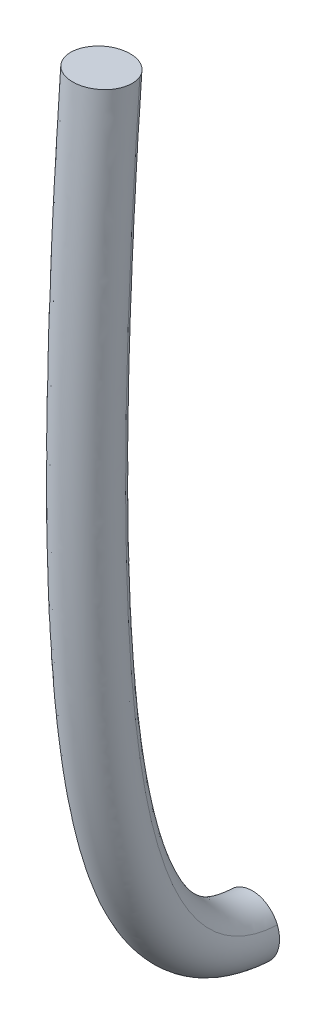
ISO-10303-21;
HEADER;
FILE_DESCRIPTION(('STEP AP214'),'2;1');
FILE_NAME('part.step','',(''),(''),'','','');
FILE_SCHEMA(('AUTOMOTIVE_DESIGN { 1 0 10303 214 1 1 1 1 }'));
ENDSEC;
DATA;
#1=APPLICATION_CONTEXT('core data for automotive mechanical design processes');
#2=APPLICATION_PROTOCOL_DEFINITION('international standard','automotive_design',2000,#1);
#3=PRODUCT_CONTEXT('',#1,'mechanical');
#4=PRODUCT('Part','Part','',(#3));
#5=PRODUCT_RELATED_PRODUCT_CATEGORY('part','',(#4));
#6=PRODUCT_DEFINITION_FORMATION('','',#4);
#7=PRODUCT_DEFINITION_CONTEXT('part definition',#1,'design');
#8=PRODUCT_DEFINITION('design','',#6,#7);
#9=PRODUCT_DEFINITION_SHAPE('','',#8);
#10=(LENGTH_UNIT() NAMED_UNIT(*) SI_UNIT(.MILLI.,.METRE.));
#11=(NAMED_UNIT(*) PLANE_ANGLE_UNIT() SI_UNIT($,.RADIAN.));
#12=(NAMED_UNIT(*) SI_UNIT($,.STERADIAN.) SOLID_ANGLE_UNIT());
#13=UNCERTAINTY_MEASURE_WITH_UNIT(LENGTH_MEASURE(1.E-05),#10,'distance_accuracy_value','');
#14=(GEOMETRIC_REPRESENTATION_CONTEXT(3) GLOBAL_UNCERTAINTY_ASSIGNED_CONTEXT((#13)) GLOBAL_UNIT_ASSIGNED_CONTEXT((#10,
#11,#12)) REPRESENTATION_CONTEXT('',''));
#15=CARTESIAN_POINT('',(0.,0.,0.));
#16=DIRECTION('',(0.,0.,1.));
#17=DIRECTION('',(1.,0.,0.));
#18=AXIS2_PLACEMENT_3D('',#15,#16,#17);
#19=CARTESIAN_POINT('',(6.135,-7.38568943191456,13.8327099550486));
#20=CARTESIAN_POINT('',(6.13500000000019,-7.37642950308164,14.0005635497388));
#21=CARTESIAN_POINT('',(6.13500000000039,-7.27630201185999,14.3051943563681));
#22=CARTESIAN_POINT('',(6.13500000000027,-6.87048763842495,14.6647986622935));
#23=CARTESIAN_POINT('',(6.13499999999988,-6.18721287212123,14.9187453845973));
#24=CARTESIAN_POINT('',(6.13499999999938,-5.06637857282801,15.0917582853281));
#25=CARTESIAN_POINT('',(6.1349999999991,-3.38097598701001,15.1354721262713));
#26=CARTESIAN_POINT('',(6.13499999999956,-1.83527381521949,15.0610044224056));
#27=CARTESIAN_POINT('',(6.135,-1.00000001490137,14.9999998509838));
#28=CARTESIAN_POINT('',(6.13499999999898,-7.43610265920569,13.8354910864138));
#29=CARTESIAN_POINT('',(6.13499999999917,-7.42638032085317,14.0117267217746));
#30=CARTESIAN_POINT('',(6.13499999999937,-7.31962468194662,14.3361245433072));
#31=CARTESIAN_POINT('',(6.13499999999925,-6.89389533022671,14.7107951255397));
#32=CARTESIAN_POINT('',(6.13499999999886,-6.19822128289278,14.9682756953358));
#33=CARTESIAN_POINT('',(6.13499999999836,-5.06946261690734,15.1423516450366));
#34=CARTESIAN_POINT('',(6.13499999999808,-3.37988784155846,15.1859645651806));
#35=CARTESIAN_POINT('',(6.13499999999854,-1.83238214013707,15.1114175914059));
#36=CARTESIAN_POINT('',(6.13499999999898,-0.99632226109376,15.0503556083956));
#37=CARTESIAN_POINT('',(6.15853259599988,-7.50310458506399,13.8391873615294));
#38=CARTESIAN_POINT('',(6.15853259600007,-7.49276812340928,14.0265551346977));
#39=CARTESIAN_POINT('',(6.15853259600027,-7.37719675920535,14.3772235723609));
#40=CARTESIAN_POINT('',(6.15853259600014,-6.92501071772779,14.7719094450455));
#41=CARTESIAN_POINT('',(6.15853259599975,-6.2128585375011,15.0340940341997));
#42=CARTESIAN_POINT('',(6.15853259599925,-5.07356712434456,15.2095861671158));
#43=CARTESIAN_POINT('',(6.15853259599897,-3.37844676350042,15.2530684469852));
#44=CARTESIAN_POINT('',(6.15853259599943,-1.82853819137031,15.1784193846486));
#45=CARTESIAN_POINT('',(6.15853259599987,-0.991434325899309,15.1172811536529));
#46=CARTESIAN_POINT('',(6.23051672248934,-7.57470643023283,13.8431373990116));
#47=CARTESIAN_POINT('',(6.23051672248953,-7.56371422248238,14.0423918012636));
#48=CARTESIAN_POINT('',(6.23051672248972,-7.43871394703462,14.4211334263148));
#49=CARTESIAN_POINT('',(6.2305167224896,-6.95826870547106,14.8371982602006));
#50=CARTESIAN_POINT('',(6.23051672248921,-6.22850855079143,15.1044187272194));
#51=CARTESIAN_POINT('',(6.23051672248871,-5.07796027042161,15.2814283140121));
#52=CARTESIAN_POINT('',(6.23051672248843,-3.37691297110332,15.3247752183585));
#53=CARTESIAN_POINT('',(6.23051672248889,-1.8244294257331,15.2500210211834));
#54=CARTESIAN_POINT('',(6.23051672248933,-0.986210816656798,15.1888013744221));
#55=CARTESIAN_POINT('',(6.32383458932841,-7.61993951400824,13.8456327589555));
#56=CARTESIAN_POINT('',(6.32383458932859,-7.60853222968721,14.0524112033145));
#57=CARTESIAN_POINT('',(6.32383458932879,-7.47758754939865,14.4488890464499));
#58=CARTESIAN_POINT('',(6.32383458932866,-6.97926901180132,14.8784755573251));
#59=CARTESIAN_POINT('',(6.32383458932828,-6.23838316291191,15.1488637581156));
#60=CARTESIAN_POINT('',(6.32383458932778,-5.08072511320705,15.326825800932));
#61=CARTESIAN_POINT('',(6.3238345893275,-3.37593454368261,15.3700807300991));
#62=CARTESIAN_POINT('',(6.32383458932795,-1.82183518908141,15.2952540751699));
#63=CARTESIAN_POINT('',(6.32383458932839,-0.982910965506188,15.2339828935585));
#64=CARTESIAN_POINT('',(6.46505004777892,-7.60399573427375,13.8447531932485));
#65=CARTESIAN_POINT('',(6.46505004777911,-7.59273493300725,14.0488763572372));
#66=CARTESIAN_POINT('',(6.46505004777931,-7.46388293185151,14.439102201827));
#67=CARTESIAN_POINT('',(6.46505004777918,-6.97186891744433,14.8639191599989));
#68=CARTESIAN_POINT('',(6.46505004777879,-6.2349051309545,15.1331937173227));
#69=CARTESIAN_POINT('',(6.46505004777829,-5.07975280530009,15.3108213637652));
#70=CARTESIAN_POINT('',(6.46505004777801,-3.37628145935932,15.3541101001363));
#71=CARTESIAN_POINT('',(6.46505004777847,-1.8227493065844,15.2793102840018));
#72=CARTESIAN_POINT('',(6.46505004777891,-0.984074098671447,15.2180572893535));
#73=CARTESIAN_POINT('',(6.59190255865427,-7.4783908676029,13.837823987302));
#74=CARTESIAN_POINT('',(6.59190255865446,-7.46828123439118,14.0210800690947));
#75=CARTESIAN_POINT('',(6.59190255865466,-7.35595700371126,14.3620579954026));
#76=CARTESIAN_POINT('',(6.59190255865453,-6.91353745520621,14.7493552287711));
#77=CARTESIAN_POINT('',(6.59190255865414,-6.20746407305423,15.0098098377819));
#78=CARTESIAN_POINT('',(6.59190255865365,-5.07205709464103,15.1847819258403));
#79=CARTESIAN_POINT('',(6.59190255865336,-3.37898186768968,15.2283148162134));
#80=CARTESIAN_POINT('',(6.59190255865382,-1.82995551064401,15.1537056777954));
#81=CARTESIAN_POINT('',(6.59190255865426,-0.993237244962187,15.0925956092416));
#82=CARTESIAN_POINT('',(6.5919939191843,-7.34852685202665,13.8306598181676));
#83=CARTESIAN_POINT('',(6.5919939191845,-7.33960769352939,13.992336310763));
#84=CARTESIAN_POINT('',(6.5919939191847,-7.24436766657213,14.2823958621835));
#85=CARTESIAN_POINT('',(6.59199391918457,-6.85323125963227,14.6308958446472));
#86=CARTESIAN_POINT('',(6.59199391918418,-6.17909647377178,14.8822359190639));
#87=CARTESIAN_POINT('',(6.59199391918369,-5.06410388091421,15.054464439268));
#88=CARTESIAN_POINT('',(6.5919939191834,-3.38177697915365,15.0982518960685));
#89=CARTESIAN_POINT('',(6.59199391918386,-1.83740560897717,15.0238418977973));
#90=CARTESIAN_POINT('',(6.5919939191843,-1.00271110536393,14.9628796355526));
#91=CARTESIAN_POINT('',(6.56289540573093,-7.28816551078303,13.8273298821886));
#92=CARTESIAN_POINT('',(6.56289540573113,-7.2797995409186,13.9789787922573));
#93=CARTESIAN_POINT('',(6.56289540573133,-7.19250252353317,14.2453715450131));
#94=CARTESIAN_POINT('',(6.56289540573121,-6.82519891110541,14.5758412914314));
#95=CARTESIAN_POINT('',(6.56289540573082,-6.16590892093881,14.822942427771));
#96=CARTESIAN_POINT('',(6.56289540573032,-5.06040529963635,14.9938946076655));
#97=CARTESIAN_POINT('',(6.56289540573004,-3.38307443858537,15.0377992173338));
#98=CARTESIAN_POINT('',(6.5628954057305,-1.84086869939204,14.9634806845541));
#99=CARTESIAN_POINT('',(6.56289540573094,-1.00711459556916,14.9025871048016));
#100=B_SPLINE_SURFACE_WITH_KNOTS('',3,3,((#19,#20,#21,#22,#23,#24,#25,#26,#27),(#28,#29,#30,#31,
#32,#33,#34,#35,#36),(#37,#38,#39,#40,#41,#42,#43,#44,#45),(#46,#47,#48,#49,#50,#51,#52,#53,
#54),(#55,#56,#57,#58,#59,#60,#61,#62,#63),(#64,#65,#66,#67,#68,#69,#70,#71,#72),(#73,#74,#75,
#76,#77,#78,#79,#80,#81),(#82,#83,#84,#85,#86,#87,#88,#89,#90),(#91,#92,#93,#94,#95,#96,#97,#98,
#99)),.UNSPECIFIED.,.F.,.F.,.F.,(4,1,1,1,1,1,4),(4,1,1,1,1,1,4),(-3.14159265358979,
-2.46839422782055,-2.24399475256414,-1.79519580205131,-1.12199737628207,-0.448798950512828,
0.448798950512828),(0.,0.142857142857143,0.285714285714286,0.428571428571429,0.571428571428571,
0.785714285714286,1.),.UNSPECIFIED.);
#101=CARTESIAN_POINT('',(6.135,-7.38568943191456,13.8327099550486));
#102=CARTESIAN_POINT('',(6.13500000000019,-7.37642950308164,14.0005635497388));
#103=CARTESIAN_POINT('',(6.13500000000039,-7.27630201185999,14.3051943563681));
#104=CARTESIAN_POINT('',(6.13500000000027,-6.87048763842495,14.6647986622935));
#105=CARTESIAN_POINT('',(6.13499999999988,-6.18721287212123,14.9187453845973));
#106=CARTESIAN_POINT('',(6.13499999999938,-5.06637857282801,15.0917582853281));
#107=CARTESIAN_POINT('',(6.1349999999991,-3.38097598701001,15.1354721262713));
#108=CARTESIAN_POINT('',(6.13499999999956,-1.83527381521949,15.0610044224056));
#109=CARTESIAN_POINT('',(6.135,-1.00000001490137,14.9999998509838));
#110=B_SPLINE_CURVE_WITH_KNOTS('',3,(#101,#102,#103,#104,#105,#106,#107,#108,#109),
.UNSPECIFIED.,.F.,.F.,(4,1,1,1,1,1,4),(0.,0.142857142857143,0.285714285714286,0.428571428571429,
0.571428571428571,0.785714285714286,1.),.UNSPECIFIED.);
#111=CARTESIAN_POINT('',(6.135,-7.38568943191456,13.8327099550486));
#112=VERTEX_POINT('',#111);
#113=CARTESIAN_POINT('',(6.135,-1.00000001490137,14.9999998509838));
#114=VERTEX_POINT('',#113);
#115=EDGE_CURVE('E11',#112,#114,#110,.T.);
#116=CARTESIAN_POINT('',(6.135,-7.38568943191456,13.8327099550486));
#117=CARTESIAN_POINT('',(6.13497851188843,-7.41102674547936,13.8341077310144));
#118=CARTESIAN_POINT('',(6.13947338119427,-7.43643661919708,13.8355095098843));
#119=CARTESIAN_POINT('',(6.15641989111839,-7.48438474954822,13.8381546499872));
#120=CARTESIAN_POINT('',(6.16886635940873,-7.50692486147214,13.8393981135704));
#121=CARTESIAN_POINT('',(6.20068330416284,-7.54640527600503,13.8415761177384));
#122=CARTESIAN_POINT('',(6.2200408465477,-7.56335592606365,13.842511229158));
#123=CARTESIAN_POINT('',(6.26308192503789,-7.58995960144777,13.8439788661257));
#124=CARTESIAN_POINT('',(6.28673700510296,-7.59965860134885,13.8445139279395));
#125=CARTESIAN_POINT('',(6.3360024079142,-7.61052250569968,13.8451132536872));
#126=CARTESIAN_POINT('',(6.36161780849648,-7.61166443301741,13.8451762500484));
#127=CARTESIAN_POINT('',(6.41188736404056,-7.60564076164674,13.8448439439795));
#128=CARTESIAN_POINT('',(6.4365399941787,-7.59846249650493,13.8444479427828));
#129=CARTESIAN_POINT('',(6.48200189430546,-7.57620577568643,13.8432201129516));
#130=CARTESIAN_POINT('',(6.50280540542193,-7.56111560985469,13.8423876383064));
#131=CARTESIAN_POINT('',(6.53850457636776,-7.52495373115703,13.8403927068077));
#132=CARTESIAN_POINT('',(6.55337687295091,-7.50385891378518,13.8392289753549));
#133=CARTESIAN_POINT('',(6.57455519825437,-7.45822830169961,13.836711685086));
#134=CARTESIAN_POINT('',(6.58102990261413,-7.43377154283501,13.8353624864168));
#135=CARTESIAN_POINT('',(6.58479275868068,-7.39652519803825,13.8333077285027));
#136=CARTESIAN_POINT('',(6.5850370863468,-7.38393178221921,13.8326129913154));
#137=CARTESIAN_POINT('',(6.58350202533105,-7.35885700605708,13.8312296986716));
#138=CARTESIAN_POINT('',(6.58172365678896,-7.34637559242475,13.8305411402754));
#139=CARTESIAN_POINT('',(6.57600536472734,-7.32135645587811,13.8291609170856));
#140=CARTESIAN_POINT('',(6.57197768492609,-7.30883843848428,13.8284703393806));
#141=CARTESIAN_POINT('',(6.56166567598472,-7.28476963572996,13.8271425429696));
#142=CARTESIAN_POINT('',(6.55538277487691,-7.27321824398578,13.8265052908116));
#143=CARTESIAN_POINT('',(6.54138753564082,-7.25220893805493,13.8253462767427));
#144=CARTESIAN_POINT('',(6.53381004365561,-7.24266029550415,13.8248195096476));
#145=CARTESIAN_POINT('',(6.51724506589336,-7.22485213141832,13.8238370920093));
#146=CARTESIAN_POINT('',(6.5082556862405,-7.21659437156812,13.8233815386525));
#147=CARTESIAN_POINT('',(6.48850529232303,-7.20109569957539,13.8225265280707));
#148=CARTESIAN_POINT('',(6.47766865951793,-7.19395061671381,13.8221323574309));
#149=CARTESIAN_POINT('',(6.45496157403371,-7.18157782530845,13.8214497913644));
#150=CARTESIAN_POINT('',(6.44309262245203,-7.17634738850572,13.8211612454287));
#151=CARTESIAN_POINT('',(6.41865840389535,-7.16811752333782,13.8207072309294));
#152=CARTESIAN_POINT('',(6.40609677621875,-7.16510744335861,13.8205411747513));
#153=CARTESIAN_POINT('',(6.38063354155679,-7.16140024659218,13.820336660941));
#154=CARTESIAN_POINT('',(6.36773172531337,-7.16070458857259,13.8202982837841));
#155=CARTESIAN_POINT('',(6.34271474272706,-7.1614567715318,13.8203397792355));
#156=CARTESIAN_POINT('',(6.33059550879233,-7.16278827147349,13.8204132336927));
#157=CARTESIAN_POINT('',(6.3067039676819,-7.16730830377202,13.8206625889567));
#158=CARTESIAN_POINT('',(6.29493184184983,-7.17049778936951,13.8208385423506));
#159=CARTESIAN_POINT('',(6.27111959197813,-7.17899365297888,13.8213072311061));
#160=CARTESIAN_POINT('',(6.25913137118903,-7.18444695905478,13.8216080720041));
#161=CARTESIAN_POINT('',(6.23632239060513,-7.19737137559694,13.8223210694088));
#162=CARTESIAN_POINT('',(6.22549999304848,-7.20483960235708,13.822733066831));
#163=CARTESIAN_POINT('',(6.19644849497153,-7.22920309143744,13.8240771201141));
#164=CARTESIAN_POINT('',(6.1802354444846,-7.24856119093582,13.8251450425737));
#165=CARTESIAN_POINT('',(6.15464149912656,-7.29145266186073,13.8275112234651));
#166=CARTESIAN_POINT('',(6.14530324356016,-7.31501098370179,13.8288108583289));
#167=CARTESIAN_POINT('',(6.13672883924081,-7.35460434736596,13.8309950935277));
#168=CARTESIAN_POINT('',(6.13501319294369,-7.37013321376563,13.8318517698353));
#169=CARTESIAN_POINT('',(6.135,-7.38568943191456,13.8327099550486));
#170=B_SPLINE_CURVE_WITH_KNOTS('',3,(#116,#117,#118,#119,#120,#121,#122,#123,#124,#125,#126,
#127,#128,#129,#130,#131,#132,#133,#134,#135,#136,#137,#138,#139,#140,#141,#142,#143,#144,#145,
#146,#147,#148,#149,#150,#151,#152,#153,#154,#155,#156,#157,#158,#159,#160,#161,#162,#163,#164,
#165,#166,#167,#168,#169),.UNSPECIFIED.,.T.,.F.,(4,2,2,2,2,2,2,2,2,2,2,2,2,2,2,2,2,2,2,2,2,2,2,
2,2,2,4),(0.,0.0759546722032972,0.15185998791554,0.227623985100319,0.302903477091036,
0.378385034578225,0.45398165440035,0.529690479570029,0.605694646546189,0.680147249176741,
0.71787143167395,0.755576596544682,0.794867402475039,0.834133372773663,0.870583032776803,
0.907082009842776,0.945862518965818,0.984587551013004,1.02312557909702,1.06168789289418,
1.098118962311,1.13456873919207,1.17388899426339,1.21315327093247,1.2874803018695,
1.36226453209398,1.40889802570424),.UNSPECIFIED.);
#171=CARTESIAN_POINT('',(6.56289540573093,-7.28816551078302,13.8273298821886));
#172=VERTEX_POINT('',#171);
#173=EDGE_CURVE('E47',#112,#172,#170,.T.);
#174=CARTESIAN_POINT('',(6.56289540573093,-7.28816551078303,13.8273298821886));
#175=CARTESIAN_POINT('',(6.56289540573113,-7.2797995409186,13.9789787922573));
#176=CARTESIAN_POINT('',(6.56289540573133,-7.19250252353317,14.2453715450131));
#177=CARTESIAN_POINT('',(6.56289540573121,-6.82519891110541,14.5758412914314));
#178=CARTESIAN_POINT('',(6.56289540573082,-6.16590892093881,14.822942427771));
#179=CARTESIAN_POINT('',(6.56289540573032,-5.06040529963635,14.9938946076655));
#180=CARTESIAN_POINT('',(6.56289540573004,-3.38307443858537,15.0377992173338));
#181=CARTESIAN_POINT('',(6.5628954057305,-1.84086869939204,14.9634806845541));
#182=CARTESIAN_POINT('',(6.56289540573094,-1.00711459556916,14.9025871048016));
#183=B_SPLINE_CURVE_WITH_KNOTS('',3,(#174,#175,#176,#177,#178,#179,#180,#181,#182),
.UNSPECIFIED.,.F.,.F.,(4,1,1,1,1,1,4),(0.,0.142857142857143,0.285714285714286,0.428571428571429,
0.571428571428571,0.785714285714286,1.),.UNSPECIFIED.);
#184=CARTESIAN_POINT('',(6.56289540573094,-1.00711459556916,14.9025871048016));
#185=VERTEX_POINT('',#184);
#186=EDGE_CURVE('E29',#172,#185,#183,.T.);
#187=CARTESIAN_POINT('',(6.135,-1.00000001490137,14.9999998509838));
#188=CARTESIAN_POINT('',(6.13501096587515,-1.00092507465906,14.987333944785));
#189=CARTESIAN_POINT('',(6.13615104539771,-1.00185040784966,14.9746642947463));
#190=CARTESIAN_POINT('',(6.14057443908917,-1.00367503130729,14.9496815740407));
#191=CARTESIAN_POINT('',(6.14386281920711,-1.00457425475633,14.9373694182447));
#192=CARTESIAN_POINT('',(6.15239292832516,-1.00631904095652,14.9134798282319));
#193=CARTESIAN_POINT('',(6.1576289818025,-1.00716475134744,14.9019003725333));
#194=CARTESIAN_POINT('',(6.16991139628657,-1.00878252677946,14.8797498123103));
#195=CARTESIAN_POINT('',(6.17695648814736,-1.00955464293257,14.8691780079608));
#196=CARTESIAN_POINT('',(6.19296361971448,-1.01102533596948,14.8490412979831));
#197=CARTESIAN_POINT('',(6.2019778707494,-1.01172092740786,14.8395172690349));
#198=CARTESIAN_POINT('',(6.22161525331569,-1.01297829834563,14.8223013624704));
#199=CARTESIAN_POINT('',(6.23223729907615,-1.01354016749619,14.8146082573518));
#200=CARTESIAN_POINT('',(6.25388994639427,-1.01448282289075,14.8017014319215));
#201=CARTESIAN_POINT('',(6.26484042093462,-1.01487350360288,14.7963522366806));
#202=CARTESIAN_POINT('',(6.28745790268963,-1.0155256988982,14.78742238716));
#203=CARTESIAN_POINT('',(6.29912587109617,-1.0157870357725,14.7838441660682));
#204=CARTESIAN_POINT('',(6.32360725691329,-1.01618694533621,14.7783686095113));
#205=CARTESIAN_POINT('',(6.33644703397561,-1.01631700417953,14.7765878455163));
#206=CARTESIAN_POINT('',(6.36223203185662,-1.01641896141205,14.7751918484118));
#207=CARTESIAN_POINT('',(6.3751770787461,-1.01639108224447,14.7755735696125));
#208=CARTESIAN_POINT('',(6.40075664593869,-1.01616723556257,14.7786384754767));
#209=CARTESIAN_POINT('',(6.41339202701998,-1.01597180595809,14.7813142950855));
#210=CARTESIAN_POINT('',(6.43797165087495,-1.01541779692755,14.7888997795432));
#211=CARTESIAN_POINT('',(6.44991548104712,-1.01505912121155,14.7938107627925));
#212=CARTESIAN_POINT('',(6.47216727068923,-1.01422538304108,14.8052262950042));
#213=CARTESIAN_POINT('',(6.48252920829699,-1.01375787345985,14.8116274301242));
#214=CARTESIAN_POINT('',(6.50214193372001,-1.01271162016017,14.8259527167275));
#215=CARTESIAN_POINT('',(6.51139207960445,-1.0121328126767,14.8338777412806));
#216=CARTESIAN_POINT('',(6.52923534884168,-1.01082673423176,14.8517605504014));
#217=CARTESIAN_POINT('',(6.53771680652522,-1.01009129309859,14.8618302008538));
#218=CARTESIAN_POINT('',(6.55275874057817,-1.00852471950504,14.8832797061691));
#219=CARTESIAN_POINT('',(6.55932203615113,-1.00769373000665,14.8946576035982));
#220=CARTESIAN_POINT('',(6.57509021396628,-1.00517382268133,14.9291601419986));
#221=CARTESIAN_POINT('',(6.58140036238587,-1.00338281229459,14.953682632974));
#222=CARTESIAN_POINT('',(6.58486936810435,-1.00066660647003,14.9908728878788));
#223=CARTESIAN_POINT('',(6.58501465935899,-0.999752518223697,15.0033885722864));
#224=CARTESIAN_POINT('',(6.58330723441275,-0.997933344474421,15.0282966756561));
#225=CARTESIAN_POINT('',(6.58145581674621,-0.997028253506319,15.040689169447));
#226=CARTESIAN_POINT('',(6.57560282765682,-0.995209198349976,15.0655956490437));
#227=CARTESIAN_POINT('',(6.57150186379969,-0.994296911455314,15.0780866693676));
#228=CARTESIAN_POINT('',(6.56106287947636,-0.992542737180257,15.1021048007797));
#229=CARTESIAN_POINT('',(6.55472517927798,-0.99170083974246,15.1136320495736));
#230=CARTESIAN_POINT('',(6.54058632319445,-0.990164763723567,15.1346639824922));
#231=CARTESIAN_POINT('',(6.53290785332855,-0.989464527416543,15.1442516089217));
#232=CARTESIAN_POINT('',(6.51611452752056,-0.988162045770194,15.1620851707225));
#233=CARTESIAN_POINT('',(6.50699911136482,-0.987559838835899,15.1703305802527));
#234=CARTESIAN_POINT('',(6.48713958165065,-0.986445252256204,15.185591485239));
#235=CARTESIAN_POINT('',(6.47634201090807,-0.985937895433309,15.1925382082745));
#236=CARTESIAN_POINT('',(6.45370128998645,-0.985068040564264,15.2044482498542));
#237=CARTESIAN_POINT('',(6.44185852672356,-0.984705489185444,15.2094122986285));
#238=CARTESIAN_POINT('',(6.41775121109023,-0.984138150089704,15.2171802981655));
#239=CARTESIAN_POINT('',(6.40550004344174,-0.983930318356436,15.2200259275605));
#240=CARTESIAN_POINT('',(6.38069428313395,-0.98366239758119,15.2236942953384));
#241=CARTESIAN_POINT('',(6.36813959060645,-0.983602357853827,15.2245163585064));
#242=CARTESIAN_POINT('',(6.34273736259017,-0.983633607400055,15.2240884901247));
#243=CARTESIAN_POINT('',(6.32989057333934,-0.983728816728489,15.2227848852351));
#244=CARTESIAN_POINT('',(6.30463072739566,-0.984082652770305,15.2179401667417));
#245=CARTESIAN_POINT('',(6.29221754762925,-0.984341232709052,15.2143996935756));
#246=CARTESIAN_POINT('',(6.26854735314498,-0.9849988086471,15.2053961723643));
#247=CARTESIAN_POINT('',(6.2572667904644,-0.985393346188199,15.199994169471));
#248=CARTESIAN_POINT('',(6.23573350142227,-0.986310620488648,15.1874348616515));
#249=CARTESIAN_POINT('',(6.22548097361987,-0.986833381946791,15.1802772185498));
#250=CARTESIAN_POINT('',(6.20604663497378,-0.988010407581998,15.1641613988254));
#251=CARTESIAN_POINT('',(6.19689924613423,-0.988667714794655,15.1551615569988));
#252=CARTESIAN_POINT('',(6.18032681591355,-0.990087423361598,15.1357229257221));
#253=CARTESIAN_POINT('',(6.17290166596955,-0.990849818086766,15.1252842270378));
#254=CARTESIAN_POINT('',(6.15379378583433,-0.993218441110989,15.092853071325));
#255=CARTESIAN_POINT('',(6.14470240060144,-0.994942236259371,15.0692508905211));
#256=CARTESIAN_POINT('',(6.13657123908168,-0.997799870375043,15.0301242012895));
#257=CARTESIAN_POINT('',(6.13498695719289,-0.998899749229353,15.0150646742881));
#258=CARTESIAN_POINT('',(6.135,-1.00000001490137,14.9999998509838));
#259=B_SPLINE_CURVE_WITH_KNOTS('',3,(#187,#188,#189,#190,#191,#192,#193,#194,#195,#196,#197,
#198,#199,#200,#201,#202,#203,#204,#205,#206,#207,#208,#209,#210,#211,#212,#213,#214,#215,#216,
#217,#218,#219,#220,#221,#222,#223,#224,#225,#226,#227,#228,#229,#230,#231,#232,#233,#234,#235,
#236,#237,#238,#239,#240,#241,#242,#243,#244,#245,#246,#247,#248,#249,#250,#251,#252,#253,#254,
#255,#256,#257,#258),.UNSPECIFIED.,.T.,.F.,(4,2,2,2,2,2,2,2,2,2,2,2,2,2,2,2,2,2,2,2,2,2,2,2,2,2,
2,2,2,2,2,2,2,2,2,4),(0.,0.0380614755925424,0.0762130302378196,0.114254271189501,
0.15226889656241,0.191450595477328,0.230605951418617,0.267031188034011,0.303506332267049,
0.342218905670017,0.380876969034119,0.419411385950192,0.457968561723743,0.49438862915164,
0.530829624944741,0.570184244886308,0.609480729404464,0.683954427969636,0.721494553125377,
0.759010279250073,0.798335334846436,0.837654761954962,0.874404951623032,0.911169504463962,
0.94952705741683,0.987870470008467,1.02543797223919,1.06301800813773,1.10156171993181,
1.14009440127486,1.17746782728286,1.21484845790954,1.25319287816779,1.29153488069426,
1.36604690516283,1.41131720761901),.UNSPECIFIED.);
#260=EDGE_CURVE('E48',#185,#114,#259,.T.);
#261=ORIENTED_EDGE('',*,*,#115,.F.);
#262=ORIENTED_EDGE('',*,*,#173,.T.);
#263=ORIENTED_EDGE('',*,*,#186,.T.);
#264=ORIENTED_EDGE('',*,*,#260,.T.);
#265=EDGE_LOOP('',(#261,#262,#263,#264));
#266=FACE_BOUND('',#265,.T.);
#267=ADVANCED_FACE('F17',(#266),#100,.T.);
#268=CARTESIAN_POINT('',(6.36,-7.38568943191911,13.8327099550486));
#269=DIRECTION('',(1.1126142427123E-12,0.0550829445172842,0.998481782118886));
#270=DIRECTION('',(0.,-0.998481782118886,0.0550829445172842));
#271=AXIS2_PLACEMENT_3D('',#268,#269,#270);
#272=PLANE('',#271);
#273=ORIENTED_EDGE('',*,*,#173,.F.);
#274=EDGE_CURVE('E50',#172,#112,#170,.T.);
#275=ORIENTED_EDGE('',*,*,#274,.F.);
#276=EDGE_LOOP('',(#273,#275));
#277=FACE_BOUND('',#276,.T.);
#278=ADVANCED_FACE('F54',(#277),#272,.F.);
#279=CARTESIAN_POINT('',(6.36,-1.00000001490116,14.9999998509884));
#280=DIRECTION('',(5.32614965869058E-13,0.997343536648528,-0.0728414024124084));
#281=DIRECTION('',(0.,0.0728414024124084,0.997343536648528));
#282=AXIS2_PLACEMENT_3D('',#279,#280,#281);
#283=PLANE('',#282);
#284=EDGE_CURVE('E56',#114,#185,#259,.T.);
#285=ORIENTED_EDGE('',*,*,#284,.F.);
#286=ORIENTED_EDGE('',*,*,#260,.F.);
#287=EDGE_LOOP('',(#285,#286));
#288=FACE_BOUND('',#287,.T.);
#289=ADVANCED_FACE('F84',(#288),#283,.T.);
#290=CARTESIAN_POINT('',(6.56289540573093,-7.28816551078303,13.8273298821886));
#291=CARTESIAN_POINT('',(6.56289540573113,-7.2797995409186,13.9789787922573));
#292=CARTESIAN_POINT('',(6.56289540573133,-7.19250252353317,14.2453715450131));
#293=CARTESIAN_POINT('',(6.56289540573121,-6.82519891110541,14.5758412914314));
#294=CARTESIAN_POINT('',(6.56289540573082,-6.16590892093881,14.822942427771));
#295=CARTESIAN_POINT('',(6.56289540573032,-5.06040529963635,14.9938946076655));
#296=CARTESIAN_POINT('',(6.56289540573004,-3.38307443858537,15.0377992173338));
#297=CARTESIAN_POINT('',(6.5628954057305,-1.84086869939204,14.9634806845541));
#298=CARTESIAN_POINT('',(6.56289540573094,-1.00711459556916,14.9025871048016));
#299=CARTESIAN_POINT('',(6.53379689227756,-7.2278041695394,13.8239999462095));
#300=CARTESIAN_POINT('',(6.53379689227776,-7.21999138830781,13.9656212737515));
#301=CARTESIAN_POINT('',(6.53379689227796,-7.14063738049421,14.2083472278428));
#302=CARTESIAN_POINT('',(6.53379689227784,-6.79716656257856,14.5207867382156));
#303=CARTESIAN_POINT('',(6.53379689227745,-6.15272136810583,14.763648936478));
#304=CARTESIAN_POINT('',(6.53379689227696,-5.05670671835848,14.9333247760631));
#305=CARTESIAN_POINT('',(6.53379689227667,-3.38437189801709,14.977346538599));
#306=CARTESIAN_POINT('',(6.53379689227713,-1.84433178980692,14.903119471311));
#307=CARTESIAN_POINT('',(6.53379689227757,-1.01151808577439,14.8422945740505));
#308=CARTESIAN_POINT('',(6.41729842642977,-7.13477482236632,13.8188678241614));
#309=CARTESIAN_POINT('',(6.41729842642997,-7.12781425313525,13.9450412092504));
#310=CARTESIAN_POINT('',(6.41729842643017,-7.06070747935452,14.1512923971261));
#311=CARTESIAN_POINT('',(6.41729842643005,-6.75395853484135,14.4359506786367));
#312=CARTESIAN_POINT('',(6.41729842642966,-6.13239127023959,14.6722737355555));
#313=CARTESIAN_POINT('',(6.41729842642917,-5.05100178036337,14.8399797200217));
#314=CARTESIAN_POINT('',(6.41729842642888,-3.38636732264229,14.8841791609685));
#315=CARTESIAN_POINT('',(6.41729842642934,-1.84966975337138,14.8100903669078));
#316=CARTESIAN_POINT('',(6.41729842642978,-1.01830477756476,14.7493712781194));
#317=CARTESIAN_POINT('',(6.1993860410834,-7.18477723401782,13.8216262921838));
#318=CARTESIAN_POINT('',(6.19938604108359,-7.17735932385622,13.9560898402499));
#319=CARTESIAN_POINT('',(6.1993860410838,-7.10365921964794,14.1819445505864));
#320=CARTESIAN_POINT('',(6.19938604108368,-6.7771909661876,14.4815211193768));
#321=CARTESIAN_POINT('',(6.19938604108329,-6.14332893785798,14.7213707279591));
#322=CARTESIAN_POINT('',(6.19938604108279,-5.05407722040911,14.890140858119));
#323=CARTESIAN_POINT('',(6.19938604108251,-3.38530305467365,14.9342504161747));
#324=CARTESIAN_POINT('',(6.19938604108297,-1.84679943176688,14.8600925592854));
#325=CARTESIAN_POINT('',(6.19938604108341,-1.01465699364517,14.7993166882115));
#326=CARTESIAN_POINT('',(6.13500000000136,-7.31847179552639,13.8290017798951));
#327=CARTESIAN_POINT('',(6.13500000000155,-7.30982729388697,13.9856996012998));
#328=CARTESIAN_POINT('',(6.13500000000175,-7.2185538476916,14.263976462999));
#329=CARTESIAN_POINT('',(6.13500000000163,-6.83926405748602,14.6035140939286));
#330=CARTESIAN_POINT('',(6.13500000000124,-6.17251867529936,14.8527305207436));
#331=CARTESIAN_POINT('',(6.13500000000074,-5.06225229432134,15.0243176262274));
#332=CARTESIAN_POINT('',(6.13500000000046,-3.3824139334775,15.0681572392635));
#333=CARTESIAN_POINT('',(6.13500000000092,-1.83913128396928,14.99378700265));
#334=CARTESIAN_POINT('',(6.13500000000136,-1.00490368664486,14.9328588411016));
#335=CARTESIAN_POINT('',(6.135,-7.38568943191456,13.8327099550486));
#336=CARTESIAN_POINT('',(6.13500000000019,-7.37642950308164,14.0005635497388));
#337=CARTESIAN_POINT('',(6.13500000000039,-7.27630201185999,14.3051943563681));
#338=CARTESIAN_POINT('',(6.13500000000027,-6.87048763842495,14.6647986622935));
#339=CARTESIAN_POINT('',(6.13499999999988,-6.18721287212123,14.9187453845973));
#340=CARTESIAN_POINT('',(6.13499999999938,-5.06637857282801,15.0917582853281));
#341=CARTESIAN_POINT('',(6.1349999999991,-3.38097598701001,15.1354721262713));
#342=CARTESIAN_POINT('',(6.13499999999956,-1.83527381521949,15.0610044224056));
#343=CARTESIAN_POINT('',(6.135,-1.00000001490137,14.9999998509838));
#344=B_SPLINE_SURFACE_WITH_KNOTS('',3,3,((#290,#291,#292,#293,#294,#295,#296,#297,#298),(#299,
#300,#301,#302,#303,#304,#305,#306,#307),(#308,#309,#310,#311,#312,#313,#314,#315,#316),(#317,
#318,#319,#320,#321,#322,#323,#324,#325),(#326,#327,#328,#329,#330,#331,#332,#333,#334),(#335,
#336,#337,#338,#339,#340,#341,#342,#343)),.UNSPECIFIED.,.F.,.F.,.F.,(4,1,1,4),(4,1,1,1,1,1,4),
(0.448798950512828,1.34639685153848,2.24399475256414,3.14159265358979),(0.,0.142857142857143,
0.285714285714286,0.428571428571429,0.571428571428571,0.785714285714286,1.),.UNSPECIFIED.);
#345=ORIENTED_EDGE('',*,*,#274,.T.);
#346=ORIENTED_EDGE('',*,*,#115,.T.);
#347=ORIENTED_EDGE('',*,*,#284,.T.);
#348=ORIENTED_EDGE('',*,*,#186,.F.);
#349=EDGE_LOOP('',(#345,#346,#347,#348));
#350=FACE_BOUND('',#349,.T.);
#351=ADVANCED_FACE('F51',(#350),#344,.T.);
#352=CLOSED_SHELL('',(#267,#278,#289,#351));
#353=MANIFOLD_SOLID_BREP('B1',#352);
#354=ADVANCED_BREP_SHAPE_REPRESENTATION('',(#18,#353),#14);
#355=SHAPE_DEFINITION_REPRESENTATION(#9,#354);
ENDSEC;
END-ISO-10303-21;
